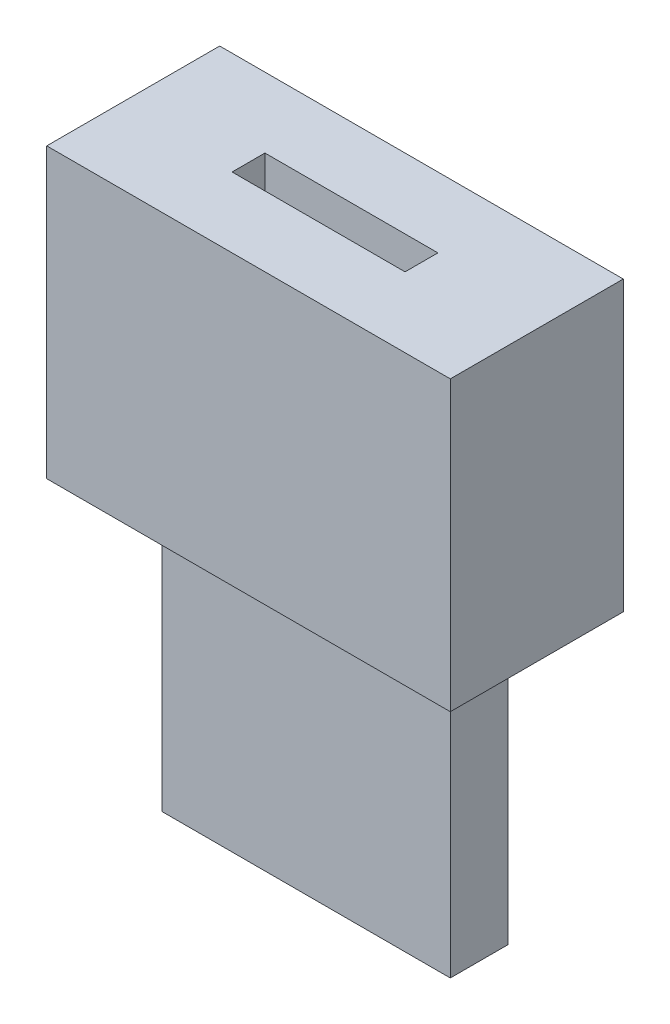
ISO-10303-21;
HEADER;
FILE_DESCRIPTION(('STEP AP214'),'2;1');
FILE_NAME('part.step','',(''),(''),'','','');
FILE_SCHEMA(('AUTOMOTIVE_DESIGN { 1 0 10303 214 1 1 1 1 }'));
ENDSEC;
DATA;
#1=APPLICATION_CONTEXT('core data for automotive mechanical design processes');
#2=APPLICATION_PROTOCOL_DEFINITION('international standard','automotive_design',2000,#1);
#3=PRODUCT_CONTEXT('',#1,'mechanical');
#4=PRODUCT('Part','Part','',(#3));
#5=PRODUCT_RELATED_PRODUCT_CATEGORY('part','',(#4));
#6=PRODUCT_DEFINITION_FORMATION('','',#4);
#7=PRODUCT_DEFINITION_CONTEXT('part definition',#1,'design');
#8=PRODUCT_DEFINITION('design','',#6,#7);
#9=PRODUCT_DEFINITION_SHAPE('','',#8);
#10=(LENGTH_UNIT() NAMED_UNIT(*) SI_UNIT(.MILLI.,.METRE.));
#11=(NAMED_UNIT(*) PLANE_ANGLE_UNIT() SI_UNIT($,.RADIAN.));
#12=(NAMED_UNIT(*) SI_UNIT($,.STERADIAN.) SOLID_ANGLE_UNIT());
#13=UNCERTAINTY_MEASURE_WITH_UNIT(LENGTH_MEASURE(1.E-05),#10,'distance_accuracy_value','');
#14=(GEOMETRIC_REPRESENTATION_CONTEXT(3) GLOBAL_UNCERTAINTY_ASSIGNED_CONTEXT((#13)) GLOBAL_UNIT_ASSIGNED_CONTEXT((#10,
#11,#12)) REPRESENTATION_CONTEXT('',''));
#15=CARTESIAN_POINT('',(0.,0.,0.));
#16=DIRECTION('',(0.,0.,1.));
#17=DIRECTION('',(1.,0.,0.));
#18=AXIS2_PLACEMENT_3D('',#15,#16,#17);
#19=CARTESIAN_POINT('',(0.,0.,0.));
#20=DIRECTION('',(0.,1.,0.));
#21=DIRECTION('',(0.,0.,1.));
#22=AXIS2_PLACEMENT_3D('',#19,#20,#21);
#23=PLANE('',#22);
#24=DIRECTION('',(1.,0.,0.));
#25=VECTOR('',#24,1.);
#26=CARTESIAN_POINT('',(0.,0.,7.5));
#27=LINE('',#26,#25);
#28=CARTESIAN_POINT('',(-17.5,0.,7.5));
#29=VERTEX_POINT('',#28);
#30=CARTESIAN_POINT('',(17.5,0.,7.5));
#31=VERTEX_POINT('',#30);
#32=EDGE_CURVE('E140',#29,#31,#27,.T.);
#33=ORIENTED_EDGE('',*,*,#32,.F.);
#34=DIRECTION('',(0.,0.,-1.));
#35=VECTOR('',#34,1.);
#36=CARTESIAN_POINT('',(-17.5,0.,0.));
#37=LINE('',#36,#35);
#38=CARTESIAN_POINT('',(-17.5,0.,-7.5));
#39=VERTEX_POINT('',#38);
#40=EDGE_CURVE('E146',#29,#39,#37,.T.);
#41=ORIENTED_EDGE('',*,*,#40,.T.);
#42=DIRECTION('',(1.,0.,0.));
#43=VECTOR('',#42,1.);
#44=CARTESIAN_POINT('',(0.,0.,-7.5));
#45=LINE('',#44,#43);
#46=CARTESIAN_POINT('',(17.5,0.,-7.5));
#47=VERTEX_POINT('',#46);
#48=EDGE_CURVE('E144',#39,#47,#45,.T.);
#49=ORIENTED_EDGE('',*,*,#48,.T.);
#50=DIRECTION('',(0.,0.,-1.));
#51=VECTOR('',#50,1.);
#52=CARTESIAN_POINT('',(17.5,0.,0.));
#53=LINE('',#52,#51);
#54=EDGE_CURVE('E127',#31,#47,#53,.T.);
#55=ORIENTED_EDGE('',*,*,#54,.F.);
#56=EDGE_LOOP('',(#33,#41,#49,#55));
#57=FACE_BOUND('',#56,.T.);
#58=DIRECTION('',(0.,0.,-1.));
#59=VECTOR('',#58,1.);
#60=CARTESIAN_POINT('',(-12.5,0.,0.));
#61=LINE('',#60,#59);
#62=CARTESIAN_POINT('',(-12.5,0.,2.5));
#63=VERTEX_POINT('',#62);
#64=CARTESIAN_POINT('',(-12.5,0.,-2.5));
#65=VERTEX_POINT('',#64);
#66=EDGE_CURVE('E205',#63,#65,#61,.T.);
#67=ORIENTED_EDGE('',*,*,#66,.F.);
#68=DIRECTION('',(1.,0.,0.));
#69=VECTOR('',#68,1.);
#70=CARTESIAN_POINT('',(0.,0.,2.5));
#71=LINE('',#70,#69);
#72=CARTESIAN_POINT('',(12.5,0.,2.5));
#73=VERTEX_POINT('',#72);
#74=EDGE_CURVE('E208',#63,#73,#71,.T.);
#75=ORIENTED_EDGE('',*,*,#74,.T.);
#76=DIRECTION('',(0.,0.,-1.));
#77=VECTOR('',#76,1.);
#78=CARTESIAN_POINT('',(12.5,0.,0.));
#79=LINE('',#78,#77);
#80=CARTESIAN_POINT('',(12.5,0.,-2.5));
#81=VERTEX_POINT('',#80);
#82=EDGE_CURVE('E59',#73,#81,#79,.T.);
#83=ORIENTED_EDGE('',*,*,#82,.T.);
#84=DIRECTION('',(1.,0.,0.));
#85=VECTOR('',#84,1.);
#86=CARTESIAN_POINT('',(0.,0.,-2.5));
#87=LINE('',#86,#85);
#88=EDGE_CURVE('E184',#65,#81,#87,.T.);
#89=ORIENTED_EDGE('',*,*,#88,.F.);
#90=EDGE_LOOP('',(#67,#75,#83,#89));
#91=FACE_BOUND('',#90,.T.);
#92=ADVANCED_FACE('F42',(#57,#91),#23,.F.);
#93=CARTESIAN_POINT('',(0.,25.,7.5));
#94=DIRECTION('',(0.,0.,-1.));
#95=DIRECTION('',(-1.,0.,0.));
#96=AXIS2_PLACEMENT_3D('',#93,#94,#95);
#97=PLANE('',#96);
#98=ORIENTED_EDGE('',*,*,#32,.T.);
#99=DIRECTION('',(0.,-1.,0.));
#100=VECTOR('',#99,1.);
#101=CARTESIAN_POINT('',(17.5,25.,7.5));
#102=LINE('',#101,#100);
#103=CARTESIAN_POINT('',(17.5,25.,7.5));
#104=VERTEX_POINT('',#103);
#105=EDGE_CURVE('E11',#104,#31,#102,.T.);
#106=ORIENTED_EDGE('',*,*,#105,.F.);
#107=DIRECTION('',(1.,0.,0.));
#108=VECTOR('',#107,1.);
#109=CARTESIAN_POINT('',(0.,25.,7.5));
#110=LINE('',#109,#108);
#111=CARTESIAN_POINT('',(-17.5,25.,7.5));
#112=VERTEX_POINT('',#111);
#113=EDGE_CURVE('E121',#112,#104,#110,.T.);
#114=ORIENTED_EDGE('',*,*,#113,.F.);
#115=DIRECTION('',(0.,-1.,0.));
#116=VECTOR('',#115,1.);
#117=CARTESIAN_POINT('',(-17.5,25.,7.5));
#118=LINE('',#117,#116);
#119=EDGE_CURVE('E68',#112,#29,#118,.T.);
#120=ORIENTED_EDGE('',*,*,#119,.T.);
#121=EDGE_LOOP('',(#98,#106,#114,#120));
#122=FACE_BOUND('',#121,.T.);
#123=ADVANCED_FACE('F270',(#122),#97,.F.);
#124=CARTESIAN_POINT('',(17.5,25.,0.));
#125=DIRECTION('',(-1.,0.,0.));
#126=DIRECTION('',(0.,0.,1.));
#127=AXIS2_PLACEMENT_3D('',#124,#125,#126);
#128=PLANE('',#127);
#129=ORIENTED_EDGE('',*,*,#54,.T.);
#130=DIRECTION('',(0.,-1.,0.));
#131=VECTOR('',#130,1.);
#132=CARTESIAN_POINT('',(17.5,25.,-7.5));
#133=LINE('',#132,#131);
#134=CARTESIAN_POINT('',(17.5,25.,-7.5));
#135=VERTEX_POINT('',#134);
#136=EDGE_CURVE('E51',#135,#47,#133,.T.);
#137=ORIENTED_EDGE('',*,*,#136,.F.);
#138=DIRECTION('',(0.,0.,-1.));
#139=VECTOR('',#138,1.);
#140=CARTESIAN_POINT('',(17.5,25.,0.));
#141=LINE('',#140,#139);
#142=EDGE_CURVE('E115',#104,#135,#141,.T.);
#143=ORIENTED_EDGE('',*,*,#142,.F.);
#144=ORIENTED_EDGE('',*,*,#105,.T.);
#145=EDGE_LOOP('',(#129,#137,#143,#144));
#146=FACE_BOUND('',#145,.T.);
#147=ADVANCED_FACE('F126',(#146),#128,.F.);
#148=CARTESIAN_POINT('',(0.,25.,-7.5));
#149=DIRECTION('',(0.,0.,-1.));
#150=DIRECTION('',(-1.,0.,0.));
#151=AXIS2_PLACEMENT_3D('',#148,#149,#150);
#152=PLANE('',#151);
#153=ORIENTED_EDGE('',*,*,#48,.F.);
#154=DIRECTION('',(0.,-1.,0.));
#155=VECTOR('',#154,1.);
#156=CARTESIAN_POINT('',(-17.5,25.,-7.5));
#157=LINE('',#156,#155);
#158=CARTESIAN_POINT('',(-17.5,25.,-7.5));
#159=VERTEX_POINT('',#158);
#160=EDGE_CURVE('E131',#159,#39,#157,.T.);
#161=ORIENTED_EDGE('',*,*,#160,.F.);
#162=DIRECTION('',(1.,0.,0.));
#163=VECTOR('',#162,1.);
#164=CARTESIAN_POINT('',(0.,25.,-7.5));
#165=LINE('',#164,#163);
#166=EDGE_CURVE('E120',#159,#135,#165,.T.);
#167=ORIENTED_EDGE('',*,*,#166,.T.);
#168=ORIENTED_EDGE('',*,*,#136,.T.);
#169=EDGE_LOOP('',(#153,#161,#167,#168));
#170=FACE_BOUND('',#169,.T.);
#171=ADVANCED_FACE('F133',(#170),#152,.T.);
#172=CARTESIAN_POINT('',(7.50000000000001,25.,0.));
#173=DIRECTION('',(-1.,0.,0.));
#174=DIRECTION('',(0.,0.,1.));
#175=AXIS2_PLACEMENT_3D('',#172,#173,#174);
#176=PLANE('',#175);
#177=DIRECTION('',(0.,-1.,0.));
#178=VECTOR('',#177,1.);
#179=CARTESIAN_POINT('',(7.50000000000001,25.,-1.42461991337143));
#180=LINE('',#179,#178);
#181=CARTESIAN_POINT('',(7.50000000000001,25.,-1.42461991337143));
#182=VERTEX_POINT('',#181);
#183=CARTESIAN_POINT('',(7.50000000000001,-25.,-1.42461991337143));
#184=VERTEX_POINT('',#183);
#185=EDGE_CURVE('E136',#182,#184,#180,.T.);
#186=ORIENTED_EDGE('',*,*,#185,.T.);
#187=DIRECTION('',(0.,0.,-1.));
#188=VECTOR('',#187,1.);
#189=CARTESIAN_POINT('',(7.50000000000001,-25.,0.));
#190=LINE('',#189,#188);
#191=CARTESIAN_POINT('',(7.50000000000001,-25.,1.42461991337143));
#192=VERTEX_POINT('',#191);
#193=EDGE_CURVE('E179',#192,#184,#190,.T.);
#194=ORIENTED_EDGE('',*,*,#193,.F.);
#195=DIRECTION('',(0.,-1.,0.));
#196=VECTOR('',#195,1.);
#197=CARTESIAN_POINT('',(7.50000000000001,25.,1.42461991337143));
#198=LINE('',#197,#196);
#199=CARTESIAN_POINT('',(7.50000000000001,25.,1.42461991337143));
#200=VERTEX_POINT('',#199);
#201=EDGE_CURVE('E46',#200,#192,#198,.T.);
#202=ORIENTED_EDGE('',*,*,#201,.F.);
#203=DIRECTION('',(0.,0.,-1.));
#204=VECTOR('',#203,1.);
#205=CARTESIAN_POINT('',(7.50000000000001,25.,0.));
#206=LINE('',#205,#204);
#207=EDGE_CURVE('E149',#200,#182,#206,.T.);
#208=ORIENTED_EDGE('',*,*,#207,.T.);
#209=EDGE_LOOP('',(#186,#194,#202,#208));
#210=FACE_BOUND('',#209,.T.);
#211=ADVANCED_FACE('F44',(#210),#176,.T.);
#212=CARTESIAN_POINT('',(0.,25.,1.42461991337143));
#213=DIRECTION('',(0.,0.,-1.));
#214=DIRECTION('',(-1.,0.,0.));
#215=AXIS2_PLACEMENT_3D('',#212,#213,#214);
#216=PLANE('',#215);
#217=ORIENTED_EDGE('',*,*,#201,.T.);
#218=DIRECTION('',(1.,0.,0.));
#219=VECTOR('',#218,1.);
#220=CARTESIAN_POINT('',(0.,-25.,1.42461991337143));
#221=LINE('',#220,#219);
#222=CARTESIAN_POINT('',(-7.50000000000001,-25.,1.42461991337143));
#223=VERTEX_POINT('',#222);
#224=EDGE_CURVE('E168',#223,#192,#221,.T.);
#225=ORIENTED_EDGE('',*,*,#224,.F.);
#226=DIRECTION('',(0.,-1.,0.));
#227=VECTOR('',#226,1.);
#228=CARTESIAN_POINT('',(-7.50000000000001,25.,1.42461991337143));
#229=LINE('',#228,#227);
#230=CARTESIAN_POINT('',(-7.50000000000001,25.,1.42461991337143));
#231=VERTEX_POINT('',#230);
#232=EDGE_CURVE('E156',#231,#223,#229,.T.);
#233=ORIENTED_EDGE('',*,*,#232,.F.);
#234=DIRECTION('',(1.,0.,0.));
#235=VECTOR('',#234,1.);
#236=CARTESIAN_POINT('',(0.,25.,1.42461991337143));
#237=LINE('',#236,#235);
#238=EDGE_CURVE('E171',#231,#200,#237,.T.);
#239=ORIENTED_EDGE('',*,*,#238,.T.);
#240=EDGE_LOOP('',(#217,#225,#233,#239));
#241=FACE_BOUND('',#240,.T.);
#242=ADVANCED_FACE('F167',(#241),#216,.T.);
#243=CARTESIAN_POINT('',(-7.50000000000001,25.,0.));
#244=DIRECTION('',(-1.,0.,0.));
#245=DIRECTION('',(0.,0.,1.));
#246=AXIS2_PLACEMENT_3D('',#243,#244,#245);
#247=PLANE('',#246);
#248=ORIENTED_EDGE('',*,*,#232,.T.);
#249=DIRECTION('',(0.,0.,-1.));
#250=VECTOR('',#249,1.);
#251=CARTESIAN_POINT('',(-7.50000000000001,-25.,0.));
#252=LINE('',#251,#250);
#253=CARTESIAN_POINT('',(-7.50000000000001,-25.,-1.42461991337143));
#254=VERTEX_POINT('',#253);
#255=EDGE_CURVE('E181',#223,#254,#252,.T.);
#256=ORIENTED_EDGE('',*,*,#255,.T.);
#257=DIRECTION('',(0.,-1.,0.));
#258=VECTOR('',#257,1.);
#259=CARTESIAN_POINT('',(-7.50000000000001,25.,-1.42461991337143));
#260=LINE('',#259,#258);
#261=CARTESIAN_POINT('',(-7.50000000000001,25.,-1.42461991337143));
#262=VERTEX_POINT('',#261);
#263=EDGE_CURVE('E154',#262,#254,#260,.T.);
#264=ORIENTED_EDGE('',*,*,#263,.F.);
#265=DIRECTION('',(0.,0.,-1.));
#266=VECTOR('',#265,1.);
#267=CARTESIAN_POINT('',(-7.50000000000001,25.,0.));
#268=LINE('',#267,#266);
#269=EDGE_CURVE('E222',#231,#262,#268,.T.);
#270=ORIENTED_EDGE('',*,*,#269,.F.);
#271=EDGE_LOOP('',(#248,#256,#264,#270));
#272=FACE_BOUND('',#271,.T.);
#273=ADVANCED_FACE('F291',(#272),#247,.F.);
#274=CARTESIAN_POINT('',(0.,25.,-1.42461991337143));
#275=DIRECTION('',(0.,0.,-1.));
#276=DIRECTION('',(-1.,0.,0.));
#277=AXIS2_PLACEMENT_3D('',#274,#275,#276);
#278=PLANE('',#277);
#279=ORIENTED_EDGE('',*,*,#263,.T.);
#280=DIRECTION('',(1.,0.,0.));
#281=VECTOR('',#280,1.);
#282=CARTESIAN_POINT('',(0.,-25.,-1.42461991337143));
#283=LINE('',#282,#281);
#284=EDGE_CURVE('E190',#254,#184,#283,.T.);
#285=ORIENTED_EDGE('',*,*,#284,.T.);
#286=ORIENTED_EDGE('',*,*,#185,.F.);
#287=DIRECTION('',(1.,0.,0.));
#288=VECTOR('',#287,1.);
#289=CARTESIAN_POINT('',(0.,25.,-1.42461991337143));
#290=LINE('',#289,#288);
#291=EDGE_CURVE('E224',#262,#182,#290,.T.);
#292=ORIENTED_EDGE('',*,*,#291,.F.);
#293=EDGE_LOOP('',(#279,#285,#286,#292));
#294=FACE_BOUND('',#293,.T.);
#295=ADVANCED_FACE('F229',(#294),#278,.F.);
#296=CARTESIAN_POINT('',(-17.5,25.,0.));
#297=DIRECTION('',(-1.,0.,0.));
#298=DIRECTION('',(0.,0.,1.));
#299=AXIS2_PLACEMENT_3D('',#296,#297,#298);
#300=PLANE('',#299);
#301=ORIENTED_EDGE('',*,*,#40,.F.);
#302=ORIENTED_EDGE('',*,*,#119,.F.);
#303=DIRECTION('',(0.,0.,-1.));
#304=VECTOR('',#303,1.);
#305=CARTESIAN_POINT('',(-17.5,25.,0.));
#306=LINE('',#305,#304);
#307=EDGE_CURVE('E134',#112,#159,#306,.T.);
#308=ORIENTED_EDGE('',*,*,#307,.T.);
#309=ORIENTED_EDGE('',*,*,#160,.T.);
#310=EDGE_LOOP('',(#301,#302,#308,#309));
#311=FACE_BOUND('',#310,.T.);
#312=ADVANCED_FACE('F282',(#311),#300,.T.);
#313=CARTESIAN_POINT('',(0.,25.,0.));
#314=DIRECTION('',(0.,1.,0.));
#315=DIRECTION('',(0.,0.,1.));
#316=AXIS2_PLACEMENT_3D('',#313,#314,#315);
#317=PLANE('',#316);
#318=ORIENTED_EDGE('',*,*,#207,.F.);
#319=ORIENTED_EDGE('',*,*,#238,.F.);
#320=ORIENTED_EDGE('',*,*,#269,.T.);
#321=ORIENTED_EDGE('',*,*,#291,.T.);
#322=EDGE_LOOP('',(#318,#319,#320,#321));
#323=FACE_BOUND('',#322,.T.);
#324=ORIENTED_EDGE('',*,*,#113,.T.);
#325=ORIENTED_EDGE('',*,*,#142,.T.);
#326=ORIENTED_EDGE('',*,*,#166,.F.);
#327=ORIENTED_EDGE('',*,*,#307,.F.);
#328=EDGE_LOOP('',(#324,#325,#326,#327));
#329=FACE_BOUND('',#328,.T.);
#330=ADVANCED_FACE('F117',(#323,#329),#317,.T.);
#331=CARTESIAN_POINT('',(-12.5,-25.,0.));
#332=DIRECTION('',(1.,0.,0.));
#333=DIRECTION('',(0.,0.,-1.));
#334=AXIS2_PLACEMENT_3D('',#331,#332,#333);
#335=PLANE('',#334);
#336=ORIENTED_EDGE('',*,*,#66,.T.);
#337=DIRECTION('',(0.,1.,0.));
#338=VECTOR('',#337,1.);
#339=CARTESIAN_POINT('',(-12.5,-25.,-2.5));
#340=LINE('',#339,#338);
#341=CARTESIAN_POINT('',(-12.5,-25.,-2.5));
#342=VERTEX_POINT('',#341);
#343=EDGE_CURVE('E142',#342,#65,#340,.T.);
#344=ORIENTED_EDGE('',*,*,#343,.F.);
#345=DIRECTION('',(0.,0.,-1.));
#346=VECTOR('',#345,1.);
#347=CARTESIAN_POINT('',(-12.5,-25.,0.));
#348=LINE('',#347,#346);
#349=CARTESIAN_POINT('',(-12.5,-25.,2.5));
#350=VERTEX_POINT('',#349);
#351=EDGE_CURVE('E192',#350,#342,#348,.T.);
#352=ORIENTED_EDGE('',*,*,#351,.F.);
#353=DIRECTION('',(0.,1.,0.));
#354=VECTOR('',#353,1.);
#355=CARTESIAN_POINT('',(-12.5,-25.,2.5));
#356=LINE('',#355,#354);
#357=EDGE_CURVE('E204',#350,#63,#356,.T.);
#358=ORIENTED_EDGE('',*,*,#357,.T.);
#359=EDGE_LOOP('',(#336,#344,#352,#358));
#360=FACE_BOUND('',#359,.T.);
#361=ADVANCED_FACE('F254',(#360),#335,.F.);
#362=CARTESIAN_POINT('',(0.,-25.,-2.5));
#363=DIRECTION('',(0.,0.,1.));
#364=DIRECTION('',(1.,0.,0.));
#365=AXIS2_PLACEMENT_3D('',#362,#363,#364);
#366=PLANE('',#365);
#367=ORIENTED_EDGE('',*,*,#88,.T.);
#368=DIRECTION('',(0.,1.,0.));
#369=VECTOR('',#368,1.);
#370=CARTESIAN_POINT('',(12.5,-25.,-2.5));
#371=LINE('',#370,#369);
#372=CARTESIAN_POINT('',(12.5,-25.,-2.5));
#373=VERTEX_POINT('',#372);
#374=EDGE_CURVE('E214',#373,#81,#371,.T.);
#375=ORIENTED_EDGE('',*,*,#374,.F.);
#376=DIRECTION('',(1.,0.,0.));
#377=VECTOR('',#376,1.);
#378=CARTESIAN_POINT('',(0.,-25.,-2.5));
#379=LINE('',#378,#377);
#380=EDGE_CURVE('E201',#342,#373,#379,.T.);
#381=ORIENTED_EDGE('',*,*,#380,.F.);
#382=ORIENTED_EDGE('',*,*,#343,.T.);
#383=EDGE_LOOP('',(#367,#375,#381,#382));
#384=FACE_BOUND('',#383,.T.);
#385=ADVANCED_FACE('F249',(#384),#366,.F.);
#386=CARTESIAN_POINT('',(12.5,-25.,0.));
#387=DIRECTION('',(1.,0.,0.));
#388=DIRECTION('',(0.,0.,-1.));
#389=AXIS2_PLACEMENT_3D('',#386,#387,#388);
#390=PLANE('',#389);
#391=ORIENTED_EDGE('',*,*,#82,.F.);
#392=DIRECTION('',(0.,1.,0.));
#393=VECTOR('',#392,1.);
#394=CARTESIAN_POINT('',(12.5,-25.,2.5));
#395=LINE('',#394,#393);
#396=CARTESIAN_POINT('',(12.5,-25.,2.5));
#397=VERTEX_POINT('',#396);
#398=EDGE_CURVE('E216',#397,#73,#395,.T.);
#399=ORIENTED_EDGE('',*,*,#398,.F.);
#400=DIRECTION('',(0.,0.,-1.));
#401=VECTOR('',#400,1.);
#402=CARTESIAN_POINT('',(12.5,-25.,0.));
#403=LINE('',#402,#401);
#404=EDGE_CURVE('E198',#397,#373,#403,.T.);
#405=ORIENTED_EDGE('',*,*,#404,.T.);
#406=ORIENTED_EDGE('',*,*,#374,.T.);
#407=EDGE_LOOP('',(#391,#399,#405,#406));
#408=FACE_BOUND('',#407,.T.);
#409=ADVANCED_FACE('F261',(#408),#390,.T.);
#410=CARTESIAN_POINT('',(0.,-25.,2.5));
#411=DIRECTION('',(0.,0.,1.));
#412=DIRECTION('',(1.,0.,0.));
#413=AXIS2_PLACEMENT_3D('',#410,#411,#412);
#414=PLANE('',#413);
#415=ORIENTED_EDGE('',*,*,#74,.F.);
#416=ORIENTED_EDGE('',*,*,#357,.F.);
#417=DIRECTION('',(1.,0.,0.));
#418=VECTOR('',#417,1.);
#419=CARTESIAN_POINT('',(0.,-25.,2.5));
#420=LINE('',#419,#418);
#421=EDGE_CURVE('E195',#350,#397,#420,.T.);
#422=ORIENTED_EDGE('',*,*,#421,.T.);
#423=ORIENTED_EDGE('',*,*,#398,.T.);
#424=EDGE_LOOP('',(#415,#416,#422,#423));
#425=FACE_BOUND('',#424,.T.);
#426=ADVANCED_FACE('F258',(#425),#414,.T.);
#427=CARTESIAN_POINT('',(0.,-25.,0.));
#428=DIRECTION('',(0.,1.,0.));
#429=DIRECTION('',(0.,0.,1.));
#430=AXIS2_PLACEMENT_3D('',#427,#428,#429);
#431=PLANE('',#430);
#432=ORIENTED_EDGE('',*,*,#193,.T.);
#433=ORIENTED_EDGE('',*,*,#284,.F.);
#434=ORIENTED_EDGE('',*,*,#255,.F.);
#435=ORIENTED_EDGE('',*,*,#224,.T.);
#436=EDGE_LOOP('',(#432,#433,#434,#435));
#437=FACE_BOUND('',#436,.T.);
#438=ORIENTED_EDGE('',*,*,#351,.T.);
#439=ORIENTED_EDGE('',*,*,#380,.T.);
#440=ORIENTED_EDGE('',*,*,#404,.F.);
#441=ORIENTED_EDGE('',*,*,#421,.F.);
#442=EDGE_LOOP('',(#438,#439,#440,#441));
#443=FACE_BOUND('',#442,.T.);
#444=ADVANCED_FACE('F175',(#437,#443),#431,.F.);
#445=CLOSED_SHELL('',(#92,#123,#147,#171,#211,#242,#273,#295,#312,#330,#361,#385,#409,#426,#444));
#446=MANIFOLD_SOLID_BREP('B2',#445);
#447=ADVANCED_BREP_SHAPE_REPRESENTATION('',(#18,#446),#14);
#448=SHAPE_DEFINITION_REPRESENTATION(#9,#447);
ENDSEC;
END-ISO-10303-21;
